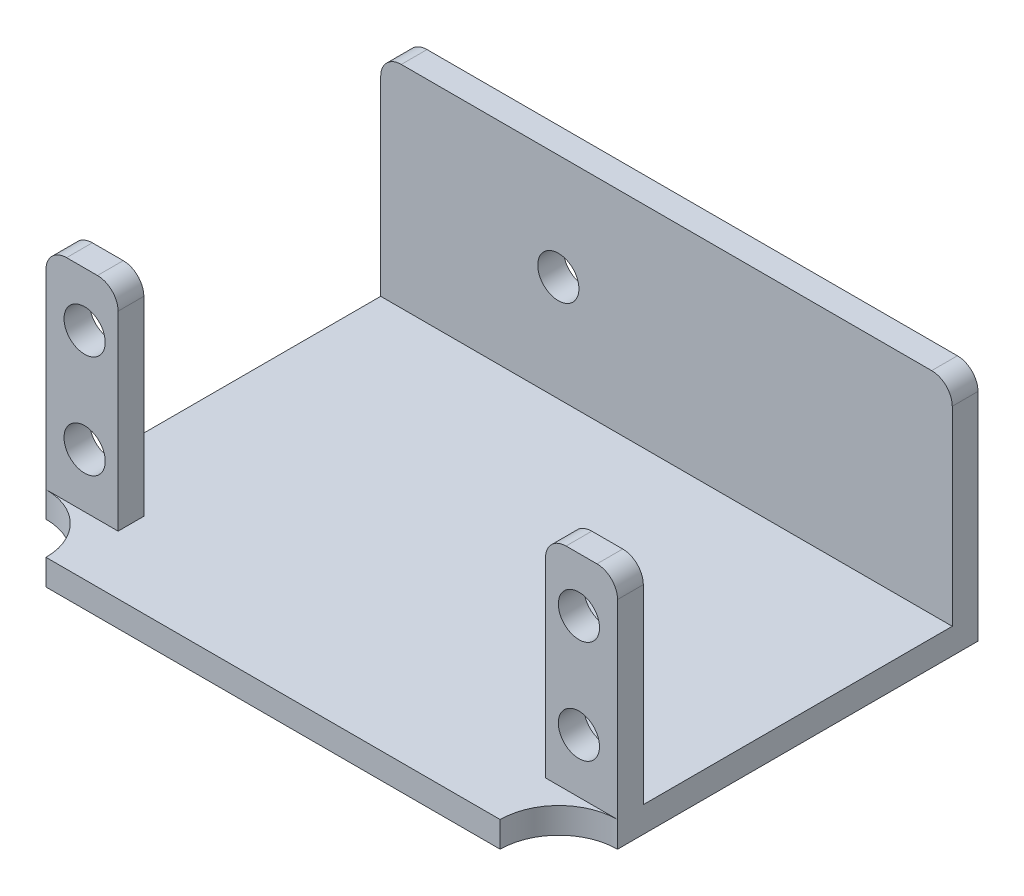
ISO-10303-21;
HEADER;
FILE_DESCRIPTION(('STEP AP214'),'2;1');
FILE_NAME('part.step','',(''),(''),'','','');
FILE_SCHEMA(('AUTOMOTIVE_DESIGN { 1 0 10303 214 1 1 1 1 }'));
ENDSEC;
DATA;
#1=APPLICATION_CONTEXT('core data for automotive mechanical design processes');
#2=APPLICATION_PROTOCOL_DEFINITION('international standard','automotive_design',2000,#1);
#3=PRODUCT_CONTEXT('',#1,'mechanical');
#4=PRODUCT('Part','Part','',(#3));
#5=PRODUCT_RELATED_PRODUCT_CATEGORY('part','',(#4));
#6=PRODUCT_DEFINITION_FORMATION('','',#4);
#7=PRODUCT_DEFINITION_CONTEXT('part definition',#1,'design');
#8=PRODUCT_DEFINITION('design','',#6,#7);
#9=PRODUCT_DEFINITION_SHAPE('','',#8);
#10=(LENGTH_UNIT() NAMED_UNIT(*) SI_UNIT(.MILLI.,.METRE.));
#11=(NAMED_UNIT(*) PLANE_ANGLE_UNIT() SI_UNIT($,.RADIAN.));
#12=(NAMED_UNIT(*) SI_UNIT($,.STERADIAN.) SOLID_ANGLE_UNIT());
#13=UNCERTAINTY_MEASURE_WITH_UNIT(LENGTH_MEASURE(1.E-05),#10,'distance_accuracy_value','');
#14=(GEOMETRIC_REPRESENTATION_CONTEXT(3) GLOBAL_UNCERTAINTY_ASSIGNED_CONTEXT((#13)) GLOBAL_UNIT_ASSIGNED_CONTEXT((#10,
#11,#12)) REPRESENTATION_CONTEXT('',''));
#15=CARTESIAN_POINT('',(0.,0.,0.));
#16=DIRECTION('',(0.,0.,1.));
#17=DIRECTION('',(1.,0.,0.));
#18=AXIS2_PLACEMENT_3D('',#15,#16,#17);
#19=CARTESIAN_POINT('',(0.,2.5,0.));
#20=DIRECTION('',(1.,0.,0.));
#21=DIRECTION('',(0.,0.,-1.));
#22=AXIS2_PLACEMENT_3D('',#19,#20,#21);
#23=PLANE('',#22);
#24=DIRECTION('',(0.,-1.,0.));
#25=VECTOR('',#24,1.);
#26=CARTESIAN_POINT('',(0.,2.5,-5.7));
#27=LINE('',#26,#25);
#28=CARTESIAN_POINT('',(0.,21.,-5.7));
#29=VERTEX_POINT('',#28);
#30=CARTESIAN_POINT('',(0.,2.5,-5.7));
#31=VERTEX_POINT('',#30);
#32=EDGE_CURVE('E256',#29,#31,#27,.T.);
#33=ORIENTED_EDGE('',*,*,#32,.F.);
#34=DIRECTION('',(0.,0.,-1.));
#35=VECTOR('',#34,1.);
#36=CARTESIAN_POINT('',(0.,21.,0.));
#37=LINE('',#36,#35);
#38=CARTESIAN_POINT('',(0.,21.,-8.2));
#39=VERTEX_POINT('',#38);
#40=EDGE_CURVE('E362',#29,#39,#37,.T.);
#41=ORIENTED_EDGE('',*,*,#40,.T.);
#42=DIRECTION('',(0.,-1.,0.));
#43=VECTOR('',#42,1.);
#44=CARTESIAN_POINT('',(0.,2.5,-8.2));
#45=LINE('',#44,#43);
#46=CARTESIAN_POINT('',(0.,2.5,-8.2));
#47=VERTEX_POINT('',#46);
#48=EDGE_CURVE('E255',#39,#47,#45,.T.);
#49=ORIENTED_EDGE('',*,*,#48,.T.);
#50=DIRECTION('',(0.,0.,1.));
#51=VECTOR('',#50,1.);
#52=CARTESIAN_POINT('',(0.,2.5,0.));
#53=LINE('',#52,#51);
#54=CARTESIAN_POINT('',(0.,2.5,-38.2));
#55=VERTEX_POINT('',#54);
#56=EDGE_CURVE('E289',#55,#47,#53,.T.);
#57=ORIENTED_EDGE('',*,*,#56,.F.);
#58=DIRECTION('',(0.,-1.,0.));
#59=VECTOR('',#58,1.);
#60=CARTESIAN_POINT('',(0.,78.5562777730834,-38.2));
#61=LINE('',#60,#59);
#62=CARTESIAN_POINT('',(0.,21.,-38.2));
#63=VERTEX_POINT('',#62);
#64=EDGE_CURVE('E404',#63,#55,#61,.T.);
#65=ORIENTED_EDGE('',*,*,#64,.F.);
#66=DIRECTION('',(0.,0.,-1.));
#67=VECTOR('',#66,1.);
#68=CARTESIAN_POINT('',(0.,21.,0.));
#69=LINE('',#68,#67);
#70=CARTESIAN_POINT('',(0.,21.,-40.7));
#71=VERTEX_POINT('',#70);
#72=EDGE_CURVE('E358',#63,#71,#69,.T.);
#73=ORIENTED_EDGE('',*,*,#72,.T.);
#74=DIRECTION('',(0.,-1.,0.));
#75=VECTOR('',#74,1.);
#76=CARTESIAN_POINT('',(0.,78.5562777730834,-40.7));
#77=LINE('',#76,#75);
#78=CARTESIAN_POINT('',(0.,0.,-40.7));
#79=VERTEX_POINT('',#78);
#80=EDGE_CURVE('E401',#71,#79,#77,.T.);
#81=ORIENTED_EDGE('',*,*,#80,.T.);
#82=DIRECTION('',(0.,0.,1.));
#83=VECTOR('',#82,1.);
#84=CARTESIAN_POINT('',(0.,0.,0.));
#85=LINE('',#84,#83);
#86=CARTESIAN_POINT('',(0.,0.,-5.7));
#87=VERTEX_POINT('',#86);
#88=EDGE_CURVE('E288',#79,#87,#85,.T.);
#89=ORIENTED_EDGE('',*,*,#88,.T.);
#90=DIRECTION('',(0.,1.,0.));
#91=VECTOR('',#90,1.);
#92=CARTESIAN_POINT('',(0.,0.,-5.7));
#93=LINE('',#92,#91);
#94=EDGE_CURVE('E416',#87,#31,#93,.T.);
#95=ORIENTED_EDGE('',*,*,#94,.T.);
#96=EDGE_LOOP('',(#33,#41,#49,#57,#65,#73,#81,#89,#95));
#97=FACE_BOUND('',#96,.T.);
#98=ADVANCED_FACE('F41',(#97),#23,.F.);
#99=CARTESIAN_POINT('',(0.,2.5,0.));
#100=DIRECTION('',(0.,0.,-1.));
#101=DIRECTION('',(-1.,0.,0.));
#102=AXIS2_PLACEMENT_3D('',#99,#100,#101);
#103=PLANE('',#102);
#104=DIRECTION('',(1.,0.,0.));
#105=VECTOR('',#104,1.);
#106=CARTESIAN_POINT('',(0.,2.5,0.));
#107=LINE('',#106,#105);
#108=CARTESIAN_POINT('',(5.7,2.5,0.));
#109=VERTEX_POINT('',#108);
#110=CARTESIAN_POINT('',(49.8,2.5,0.));
#111=VERTEX_POINT('',#110);
#112=EDGE_CURVE('E210',#109,#111,#107,.T.);
#113=ORIENTED_EDGE('',*,*,#112,.F.);
#114=DIRECTION('',(0.,1.,0.));
#115=VECTOR('',#114,1.);
#116=CARTESIAN_POINT('',(5.7,0.,0.));
#117=LINE('',#116,#115);
#118=CARTESIAN_POINT('',(5.7,0.,0.));
#119=VERTEX_POINT('',#118);
#120=EDGE_CURVE('E490',#109,#119,#117,.F.);
#121=ORIENTED_EDGE('',*,*,#120,.T.);
#122=DIRECTION('',(1.,0.,0.));
#123=VECTOR('',#122,1.);
#124=CARTESIAN_POINT('',(0.,0.,0.));
#125=LINE('',#124,#123);
#126=CARTESIAN_POINT('',(49.8,0.,0.));
#127=VERTEX_POINT('',#126);
#128=EDGE_CURVE('E308',#119,#127,#125,.T.);
#129=ORIENTED_EDGE('',*,*,#128,.T.);
#130=DIRECTION('',(0.,1.,0.));
#131=VECTOR('',#130,1.);
#132=CARTESIAN_POINT('',(49.8,0.,0.));
#133=LINE('',#132,#131);
#134=EDGE_CURVE('E196',#127,#111,#133,.T.);
#135=ORIENTED_EDGE('',*,*,#134,.T.);
#136=EDGE_LOOP('',(#113,#121,#129,#135));
#137=FACE_BOUND('',#136,.T.);
#138=ADVANCED_FACE('F506',(#137),#103,.F.);
#139=CARTESIAN_POINT('',(55.5,2.5,0.));
#140=DIRECTION('',(-1.,0.,0.));
#141=DIRECTION('',(0.,0.,1.));
#142=AXIS2_PLACEMENT_3D('',#139,#140,#141);
#143=PLANE('',#142);
#144=DIRECTION('',(0.,1.,0.));
#145=VECTOR('',#144,1.);
#146=CARTESIAN_POINT('',(55.5,2.5,-8.2));
#147=LINE('',#146,#145);
#148=CARTESIAN_POINT('',(55.5,2.5,-8.2));
#149=VERTEX_POINT('',#148);
#150=CARTESIAN_POINT('',(55.5,21.,-8.2));
#151=VERTEX_POINT('',#150);
#152=EDGE_CURVE('E243',#149,#151,#147,.T.);
#153=ORIENTED_EDGE('',*,*,#152,.T.);
#154=DIRECTION('',(0.,0.,-1.));
#155=VECTOR('',#154,1.);
#156=CARTESIAN_POINT('',(55.5,21.,0.));
#157=LINE('',#156,#155);
#158=CARTESIAN_POINT('',(55.5,21.,-5.7));
#159=VERTEX_POINT('',#158);
#160=EDGE_CURVE('E227',#151,#159,#157,.F.);
#161=ORIENTED_EDGE('',*,*,#160,.T.);
#162=DIRECTION('',(0.,1.,0.));
#163=VECTOR('',#162,1.);
#164=CARTESIAN_POINT('',(55.5,2.5,-5.7));
#165=LINE('',#164,#163);
#166=CARTESIAN_POINT('',(55.5,2.5,-5.7));
#167=VERTEX_POINT('',#166);
#168=EDGE_CURVE('E217',#167,#159,#165,.T.);
#169=ORIENTED_EDGE('',*,*,#168,.F.);
#170=DIRECTION('',(0.,1.,0.));
#171=VECTOR('',#170,1.);
#172=CARTESIAN_POINT('',(55.5,0.,-5.7));
#173=LINE('',#172,#171);
#174=CARTESIAN_POINT('',(55.5,0.,-5.7));
#175=VERTEX_POINT('',#174);
#176=EDGE_CURVE('E184',#167,#175,#173,.F.);
#177=ORIENTED_EDGE('',*,*,#176,.T.);
#178=DIRECTION('',(0.,0.,-1.));
#179=VECTOR('',#178,1.);
#180=CARTESIAN_POINT('',(55.5,0.,0.));
#181=LINE('',#180,#179);
#182=CARTESIAN_POINT('',(55.5,0.,-40.7));
#183=VERTEX_POINT('',#182);
#184=EDGE_CURVE('E293',#175,#183,#181,.T.);
#185=ORIENTED_EDGE('',*,*,#184,.T.);
#186=DIRECTION('',(0.,-1.,0.));
#187=VECTOR('',#186,1.);
#188=CARTESIAN_POINT('',(55.5,78.5562777730834,-40.7));
#189=LINE('',#188,#187);
#190=CARTESIAN_POINT('',(55.5,21.,-40.7));
#191=VERTEX_POINT('',#190);
#192=EDGE_CURVE('E410',#191,#183,#189,.T.);
#193=ORIENTED_EDGE('',*,*,#192,.F.);
#194=DIRECTION('',(0.,0.,1.));
#195=VECTOR('',#194,1.);
#196=CARTESIAN_POINT('',(55.5,21.,0.));
#197=LINE('',#196,#195);
#198=CARTESIAN_POINT('',(55.5,21.,-38.2));
#199=VERTEX_POINT('',#198);
#200=EDGE_CURVE('E366',#191,#199,#197,.T.);
#201=ORIENTED_EDGE('',*,*,#200,.T.);
#202=DIRECTION('',(0.,-1.,0.));
#203=VECTOR('',#202,1.);
#204=CARTESIAN_POINT('',(55.5,78.5562777730834,-38.2));
#205=LINE('',#204,#203);
#206=CARTESIAN_POINT('',(55.5,2.5,-38.2));
#207=VERTEX_POINT('',#206);
#208=EDGE_CURVE('E414',#199,#207,#205,.T.);
#209=ORIENTED_EDGE('',*,*,#208,.T.);
#210=DIRECTION('',(0.,0.,-1.));
#211=VECTOR('',#210,1.);
#212=CARTESIAN_POINT('',(55.5,2.5,0.));
#213=LINE('',#212,#211);
#214=EDGE_CURVE('E296',#149,#207,#213,.T.);
#215=ORIENTED_EDGE('',*,*,#214,.F.);
#216=EDGE_LOOP('',(#153,#161,#169,#177,#185,#193,#201,#209,#215));
#217=FACE_BOUND('',#216,.T.);
#218=ADVANCED_FACE('F225',(#217),#143,.F.);
#219=CARTESIAN_POINT('',(0.,2.5,0.));
#220=DIRECTION('',(0.,-1.,0.));
#221=DIRECTION('',(0.,0.,-1.));
#222=AXIS2_PLACEMENT_3D('',#219,#220,#221);
#223=PLANE('',#222);
#224=DIRECTION('',(1.,0.,0.));
#225=VECTOR('',#224,1.);
#226=CARTESIAN_POINT('',(0.,2.5,-5.7));
#227=LINE('',#226,#225);
#228=CARTESIAN_POINT('',(7.,2.5,-5.7));
#229=VERTEX_POINT('',#228);
#230=EDGE_CURVE('E259',#31,#229,#227,.T.);
#231=ORIENTED_EDGE('',*,*,#230,.F.);
#232=CARTESIAN_POINT('',(0.,2.5,0.));
#233=DIRECTION('',(0.,1.,0.));
#234=DIRECTION('',(0.,0.,1.));
#235=AXIS2_PLACEMENT_3D('',#232,#233,#234);
#236=CIRCLE('',#235,5.7);
#237=EDGE_CURVE('E486',#109,#31,#236,.T.);
#238=ORIENTED_EDGE('',*,*,#237,.F.);
#239=ORIENTED_EDGE('',*,*,#112,.T.);
#240=CARTESIAN_POINT('',(55.5,2.5,0.));
#241=DIRECTION('',(0.,1.,0.));
#242=DIRECTION('',(0.,0.,1.));
#243=AXIS2_PLACEMENT_3D('',#240,#241,#242);
#244=CIRCLE('',#243,5.7);
#245=EDGE_CURVE('E187',#167,#111,#244,.T.);
#246=ORIENTED_EDGE('',*,*,#245,.F.);
#247=DIRECTION('',(1.,0.,0.));
#248=VECTOR('',#247,1.);
#249=CARTESIAN_POINT('',(55.5,2.5,-5.7));
#250=LINE('',#249,#248);
#251=CARTESIAN_POINT('',(48.5,2.5,-5.7));
#252=VERTEX_POINT('',#251);
#253=EDGE_CURVE('E206',#252,#167,#250,.T.);
#254=ORIENTED_EDGE('',*,*,#253,.F.);
#255=DIRECTION('',(0.,0.,-1.));
#256=VECTOR('',#255,1.);
#257=CARTESIAN_POINT('',(48.5,2.5,-5.7));
#258=LINE('',#257,#256);
#259=CARTESIAN_POINT('',(48.5,2.5,-8.2));
#260=VERTEX_POINT('',#259);
#261=EDGE_CURVE('E222',#252,#260,#258,.T.);
#262=ORIENTED_EDGE('',*,*,#261,.T.);
#263=DIRECTION('',(1.,0.,0.));
#264=VECTOR('',#263,1.);
#265=CARTESIAN_POINT('',(55.5,2.5,-8.2));
#266=LINE('',#265,#264);
#267=EDGE_CURVE('E230',#260,#149,#266,.T.);
#268=ORIENTED_EDGE('',*,*,#267,.T.);
#269=ORIENTED_EDGE('',*,*,#214,.T.);
#270=DIRECTION('',(-1.,0.,0.));
#271=VECTOR('',#270,1.);
#272=CARTESIAN_POINT('',(0.,2.5,-38.2));
#273=LINE('',#272,#271);
#274=EDGE_CURVE('E300',#207,#55,#273,.T.);
#275=ORIENTED_EDGE('',*,*,#274,.T.);
#276=ORIENTED_EDGE('',*,*,#56,.T.);
#277=DIRECTION('',(1.,0.,0.));
#278=VECTOR('',#277,1.);
#279=CARTESIAN_POINT('',(0.,2.5,-8.2));
#280=LINE('',#279,#278);
#281=CARTESIAN_POINT('',(7.,2.5,-8.2));
#282=VERTEX_POINT('',#281);
#283=EDGE_CURVE('E275',#47,#282,#280,.T.);
#284=ORIENTED_EDGE('',*,*,#283,.T.);
#285=DIRECTION('',(0.,0.,-1.));
#286=VECTOR('',#285,1.);
#287=CARTESIAN_POINT('',(7.,2.5,-5.7));
#288=LINE('',#287,#286);
#289=EDGE_CURVE('E272',#229,#282,#288,.T.);
#290=ORIENTED_EDGE('',*,*,#289,.F.);
#291=EDGE_LOOP('',(#231,#238,#239,#246,#254,#262,#268,#269,#275,#276,#284,#290));
#292=FACE_BOUND('',#291,.T.);
#293=ADVANCED_FACE('F204',(#292),#223,.F.);
#294=CARTESIAN_POINT('',(0.,0.,0.));
#295=DIRECTION('',(0.,-1.,0.));
#296=DIRECTION('',(0.,0.,-1.));
#297=AXIS2_PLACEMENT_3D('',#294,#295,#296);
#298=PLANE('',#297);
#299=CARTESIAN_POINT('',(0.,0.,0.));
#300=DIRECTION('',(0.,1.,0.));
#301=DIRECTION('',(0.,0.,1.));
#302=AXIS2_PLACEMENT_3D('',#299,#300,#301);
#303=CIRCLE('',#302,5.7);
#304=EDGE_CURVE('E197',#119,#87,#303,.T.);
#305=ORIENTED_EDGE('',*,*,#304,.T.);
#306=ORIENTED_EDGE('',*,*,#88,.F.);
#307=DIRECTION('',(-1.,0.,0.));
#308=VECTOR('',#307,1.);
#309=CARTESIAN_POINT('',(0.,0.,-40.7));
#310=LINE('',#309,#308);
#311=EDGE_CURVE('E408',#183,#79,#310,.T.);
#312=ORIENTED_EDGE('',*,*,#311,.F.);
#313=ORIENTED_EDGE('',*,*,#184,.F.);
#314=CARTESIAN_POINT('',(55.5,0.,0.));
#315=DIRECTION('',(0.,1.,0.));
#316=DIRECTION('',(0.,0.,1.));
#317=AXIS2_PLACEMENT_3D('',#314,#315,#316);
#318=CIRCLE('',#317,5.7);
#319=EDGE_CURVE('E190',#175,#127,#318,.T.);
#320=ORIENTED_EDGE('',*,*,#319,.T.);
#321=ORIENTED_EDGE('',*,*,#128,.F.);
#322=EDGE_LOOP('',(#305,#306,#312,#313,#320,#321));
#323=FACE_BOUND('',#322,.T.);
#324=ADVANCED_FACE('F508',(#323),#298,.T.);
#325=CARTESIAN_POINT('',(7.,2.5,-5.7));
#326=DIRECTION('',(-1.,0.,0.));
#327=DIRECTION('',(0.,0.,1.));
#328=AXIS2_PLACEMENT_3D('',#325,#326,#327);
#329=PLANE('',#328);
#330=DIRECTION('',(0.,1.,0.));
#331=VECTOR('',#330,1.);
#332=CARTESIAN_POINT('',(7.,2.5,-8.2));
#333=LINE('',#332,#331);
#334=CARTESIAN_POINT('',(7.,21.,-8.2));
#335=VERTEX_POINT('',#334);
#336=EDGE_CURVE('E278',#282,#335,#333,.T.);
#337=ORIENTED_EDGE('',*,*,#336,.T.);
#338=DIRECTION('',(0.,0.,-1.));
#339=VECTOR('',#338,1.);
#340=CARTESIAN_POINT('',(7.,21.,-5.7));
#341=LINE('',#340,#339);
#342=CARTESIAN_POINT('',(7.,21.,-5.7));
#343=VERTEX_POINT('',#342);
#344=EDGE_CURVE('E326',#335,#343,#341,.F.);
#345=ORIENTED_EDGE('',*,*,#344,.T.);
#346=DIRECTION('',(0.,1.,0.));
#347=VECTOR('',#346,1.);
#348=CARTESIAN_POINT('',(7.,2.5,-5.7));
#349=LINE('',#348,#347);
#350=EDGE_CURVE('E264',#229,#343,#349,.T.);
#351=ORIENTED_EDGE('',*,*,#350,.F.);
#352=ORIENTED_EDGE('',*,*,#289,.T.);
#353=EDGE_LOOP('',(#337,#345,#351,#352));
#354=FACE_BOUND('',#353,.T.);
#355=ADVANCED_FACE('F633',(#354),#329,.F.);
#356=CARTESIAN_POINT('',(0.,23.,-5.7));
#357=DIRECTION('',(0.,-1.,0.));
#358=DIRECTION('',(0.,0.,-1.));
#359=AXIS2_PLACEMENT_3D('',#356,#357,#358);
#360=PLANE('',#359);
#361=DIRECTION('',(-1.,0.,0.));
#362=VECTOR('',#361,1.);
#363=CARTESIAN_POINT('',(0.,23.,-5.7));
#364=LINE('',#363,#362);
#365=CARTESIAN_POINT('',(5.,23.,-5.7));
#366=VERTEX_POINT('',#365);
#367=CARTESIAN_POINT('',(2.,23.,-5.7));
#368=VERTEX_POINT('',#367);
#369=EDGE_CURVE('E268',#366,#368,#364,.T.);
#370=ORIENTED_EDGE('',*,*,#369,.F.);
#371=DIRECTION('',(0.,0.,-1.));
#372=VECTOR('',#371,1.);
#373=CARTESIAN_POINT('',(5.,23.,-5.7));
#374=LINE('',#373,#372);
#375=CARTESIAN_POINT('',(5.,23.,-8.2));
#376=VERTEX_POINT('',#375);
#377=EDGE_CURVE('E316',#366,#376,#374,.T.);
#378=ORIENTED_EDGE('',*,*,#377,.T.);
#379=DIRECTION('',(-1.,0.,0.));
#380=VECTOR('',#379,1.);
#381=CARTESIAN_POINT('',(0.,23.,-8.2));
#382=LINE('',#381,#380);
#383=CARTESIAN_POINT('',(2.,23.,-8.2));
#384=VERTEX_POINT('',#383);
#385=EDGE_CURVE('E260',#376,#384,#382,.T.);
#386=ORIENTED_EDGE('',*,*,#385,.T.);
#387=DIRECTION('',(0.,0.,-1.));
#388=VECTOR('',#387,1.);
#389=CARTESIAN_POINT('',(2.,23.,-5.7));
#390=LINE('',#389,#388);
#391=EDGE_CURVE('E304',#384,#368,#390,.F.);
#392=ORIENTED_EDGE('',*,*,#391,.T.);
#393=EDGE_LOOP('',(#370,#378,#386,#392));
#394=FACE_BOUND('',#393,.T.);
#395=ADVANCED_FACE('F461',(#394),#360,.F.);
#396=CARTESIAN_POINT('',(0.,0.,-5.7));
#397=DIRECTION('',(0.,0.,-1.));
#398=DIRECTION('',(-1.,0.,0.));
#399=AXIS2_PLACEMENT_3D('',#396,#397,#398);
#400=PLANE('',#399);
#401=CARTESIAN_POINT('',(3.75,7.75,-5.7));
#402=DIRECTION('',(0.,0.,1.));
#403=DIRECTION('',(-1.,0.,0.));
#404=AXIS2_PLACEMENT_3D('',#401,#402,#403);
#405=CIRCLE('',#404,2.);
#406=CARTESIAN_POINT('',(1.75,7.75,-5.7));
#407=VERTEX_POINT('',#406);
#408=EDGE_CURVE('E429',#407,#407,#405,.T.);
#409=ORIENTED_EDGE('',*,*,#408,.F.);
#410=EDGE_LOOP('',(#409));
#411=FACE_BOUND('',#410,.T.);
#412=CARTESIAN_POINT('',(3.75,17.75,-5.7));
#413=DIRECTION('',(0.,0.,1.));
#414=DIRECTION('',(1.,0.,0.));
#415=AXIS2_PLACEMENT_3D('',#412,#413,#414);
#416=CIRCLE('',#415,2.);
#417=CARTESIAN_POINT('',(5.75,17.75,-5.7));
#418=VERTEX_POINT('',#417);
#419=EDGE_CURVE('E238',#418,#418,#416,.T.);
#420=ORIENTED_EDGE('',*,*,#419,.F.);
#421=EDGE_LOOP('',(#420));
#422=FACE_BOUND('',#421,.T.);
#423=ORIENTED_EDGE('',*,*,#350,.T.);
#424=CARTESIAN_POINT('',(5.,21.,-5.7));
#425=DIRECTION('',(0.,0.,-1.));
#426=DIRECTION('',(-1.,0.,0.));
#427=AXIS2_PLACEMENT_3D('',#424,#425,#426);
#428=CIRCLE('',#427,2.);
#429=EDGE_CURVE('E332',#343,#366,#428,.F.);
#430=ORIENTED_EDGE('',*,*,#429,.T.);
#431=ORIENTED_EDGE('',*,*,#369,.T.);
#432=CARTESIAN_POINT('',(2.,21.,-5.7));
#433=DIRECTION('',(0.,0.,-1.));
#434=DIRECTION('',(-1.,0.,0.));
#435=AXIS2_PLACEMENT_3D('',#432,#433,#434);
#436=CIRCLE('',#435,2.);
#437=EDGE_CURVE('E329',#368,#29,#436,.F.);
#438=ORIENTED_EDGE('',*,*,#437,.T.);
#439=ORIENTED_EDGE('',*,*,#32,.T.);
#440=ORIENTED_EDGE('',*,*,#230,.T.);
#441=EDGE_LOOP('',(#423,#430,#431,#438,#439,#440));
#442=FACE_BOUND('',#441,.T.);
#443=ADVANCED_FACE('F457',(#411,#422,#442),#400,.F.);
#444=CARTESIAN_POINT('',(0.,0.,-8.2));
#445=DIRECTION('',(0.,0.,-1.));
#446=DIRECTION('',(-1.,0.,0.));
#447=AXIS2_PLACEMENT_3D('',#444,#445,#446);
#448=PLANE('',#447);
#449=CARTESIAN_POINT('',(3.75,7.75,-8.2));
#450=DIRECTION('',(0.,0.,1.));
#451=DIRECTION('',(-1.,0.,0.));
#452=AXIS2_PLACEMENT_3D('',#449,#450,#451);
#453=CIRCLE('',#452,2.);
#454=CARTESIAN_POINT('',(1.75,7.75,-8.2));
#455=VERTEX_POINT('',#454);
#456=EDGE_CURVE('E425',#455,#455,#453,.T.);
#457=ORIENTED_EDGE('',*,*,#456,.T.);
#458=EDGE_LOOP('',(#457));
#459=FACE_BOUND('',#458,.T.);
#460=CARTESIAN_POINT('',(3.75,17.75,-8.2));
#461=DIRECTION('',(0.,0.,1.));
#462=DIRECTION('',(1.,0.,0.));
#463=AXIS2_PLACEMENT_3D('',#460,#461,#462);
#464=CIRCLE('',#463,2.);
#465=CARTESIAN_POINT('',(5.75,17.75,-8.2));
#466=VERTEX_POINT('',#465);
#467=EDGE_CURVE('E247',#466,#466,#464,.T.);
#468=ORIENTED_EDGE('',*,*,#467,.T.);
#469=EDGE_LOOP('',(#468));
#470=FACE_BOUND('',#469,.T.);
#471=ORIENTED_EDGE('',*,*,#385,.F.);
#472=CARTESIAN_POINT('',(5.,21.,-8.2));
#473=DIRECTION('',(0.,0.,-1.));
#474=DIRECTION('',(-1.,0.,0.));
#475=AXIS2_PLACEMENT_3D('',#472,#473,#474);
#476=CIRCLE('',#475,2.);
#477=EDGE_CURVE('E323',#376,#335,#476,.T.);
#478=ORIENTED_EDGE('',*,*,#477,.T.);
#479=ORIENTED_EDGE('',*,*,#336,.F.);
#480=ORIENTED_EDGE('',*,*,#283,.F.);
#481=ORIENTED_EDGE('',*,*,#48,.F.);
#482=CARTESIAN_POINT('',(2.,21.,-8.2));
#483=DIRECTION('',(0.,0.,-1.));
#484=DIRECTION('',(-1.,0.,0.));
#485=AXIS2_PLACEMENT_3D('',#482,#483,#484);
#486=CIRCLE('',#485,2.);
#487=EDGE_CURVE('E320',#39,#384,#486,.T.);
#488=ORIENTED_EDGE('',*,*,#487,.T.);
#489=EDGE_LOOP('',(#471,#478,#479,#480,#481,#488));
#490=FACE_BOUND('',#489,.T.);
#491=ADVANCED_FACE('F460',(#459,#470,#490),#448,.T.);
#492=CARTESIAN_POINT('',(55.5,23.,-5.7));
#493=DIRECTION('',(0.,-1.,0.));
#494=DIRECTION('',(0.,0.,-1.));
#495=AXIS2_PLACEMENT_3D('',#492,#493,#494);
#496=PLANE('',#495);
#497=DIRECTION('',(-1.,0.,0.));
#498=VECTOR('',#497,1.);
#499=CARTESIAN_POINT('',(55.5,23.,-8.2));
#500=LINE('',#499,#498);
#501=CARTESIAN_POINT('',(53.5,23.,-8.2));
#502=VERTEX_POINT('',#501);
#503=CARTESIAN_POINT('',(50.5,23.,-8.2));
#504=VERTEX_POINT('',#503);
#505=EDGE_CURVE('E246',#502,#504,#500,.T.);
#506=ORIENTED_EDGE('',*,*,#505,.T.);
#507=DIRECTION('',(0.,0.,-1.));
#508=VECTOR('',#507,1.);
#509=CARTESIAN_POINT('',(50.5,23.,-5.7));
#510=LINE('',#509,#508);
#511=CARTESIAN_POINT('',(50.5,23.,-5.7));
#512=VERTEX_POINT('',#511);
#513=EDGE_CURVE('E349',#504,#512,#510,.F.);
#514=ORIENTED_EDGE('',*,*,#513,.T.);
#515=DIRECTION('',(-1.,0.,0.));
#516=VECTOR('',#515,1.);
#517=CARTESIAN_POINT('',(55.5,23.,-5.7));
#518=LINE('',#517,#516);
#519=CARTESIAN_POINT('',(53.5,23.,-5.7));
#520=VERTEX_POINT('',#519);
#521=EDGE_CURVE('E229',#520,#512,#518,.T.);
#522=ORIENTED_EDGE('',*,*,#521,.F.);
#523=DIRECTION('',(0.,0.,-1.));
#524=VECTOR('',#523,1.);
#525=CARTESIAN_POINT('',(53.5,23.,-5.7));
#526=LINE('',#525,#524);
#527=EDGE_CURVE('E345',#520,#502,#526,.T.);
#528=ORIENTED_EDGE('',*,*,#527,.T.);
#529=EDGE_LOOP('',(#506,#514,#522,#528));
#530=FACE_BOUND('',#529,.T.);
#531=ADVANCED_FACE('F623',(#530),#496,.F.);
#532=CARTESIAN_POINT('',(48.5,2.5,-5.7));
#533=DIRECTION('',(1.,0.,0.));
#534=DIRECTION('',(0.,0.,-1.));
#535=AXIS2_PLACEMENT_3D('',#532,#533,#534);
#536=PLANE('',#535);
#537=DIRECTION('',(0.,-1.,0.));
#538=VECTOR('',#537,1.);
#539=CARTESIAN_POINT('',(48.5,2.5,-5.7));
#540=LINE('',#539,#538);
#541=CARTESIAN_POINT('',(48.5,21.,-5.7));
#542=VERTEX_POINT('',#541);
#543=EDGE_CURVE('E220',#542,#252,#540,.T.);
#544=ORIENTED_EDGE('',*,*,#543,.F.);
#545=DIRECTION('',(0.,0.,-1.));
#546=VECTOR('',#545,1.);
#547=CARTESIAN_POINT('',(48.5,21.,-5.7));
#548=LINE('',#547,#546);
#549=CARTESIAN_POINT('',(48.5,21.,-8.2));
#550=VERTEX_POINT('',#549);
#551=EDGE_CURVE('E335',#542,#550,#548,.T.);
#552=ORIENTED_EDGE('',*,*,#551,.T.);
#553=DIRECTION('',(0.,-1.,0.));
#554=VECTOR('',#553,1.);
#555=CARTESIAN_POINT('',(48.5,2.5,-8.2));
#556=LINE('',#555,#554);
#557=EDGE_CURVE('E235',#550,#260,#556,.T.);
#558=ORIENTED_EDGE('',*,*,#557,.T.);
#559=ORIENTED_EDGE('',*,*,#261,.F.);
#560=EDGE_LOOP('',(#544,#552,#558,#559));
#561=FACE_BOUND('',#560,.T.);
#562=ADVANCED_FACE('F616',(#561),#536,.F.);
#563=CARTESIAN_POINT('',(0.,0.,-5.7));
#564=DIRECTION('',(0.,0.,1.));
#565=DIRECTION('',(1.,0.,0.));
#566=AXIS2_PLACEMENT_3D('',#563,#564,#565);
#567=PLANE('',#566);
#568=CARTESIAN_POINT('',(51.75,17.75,-5.7));
#569=DIRECTION('',(0.,0.,1.));
#570=DIRECTION('',(-1.,0.,0.));
#571=AXIS2_PLACEMENT_3D('',#568,#569,#570);
#572=CIRCLE('',#571,2.);
#573=CARTESIAN_POINT('',(49.75,17.75,-5.7));
#574=VERTEX_POINT('',#573);
#575=EDGE_CURVE('E396',#574,#574,#572,.T.);
#576=ORIENTED_EDGE('',*,*,#575,.F.);
#577=EDGE_LOOP('',(#576));
#578=FACE_BOUND('',#577,.T.);
#579=CARTESIAN_POINT('',(51.75,7.75,-5.7));
#580=DIRECTION('',(0.,0.,1.));
#581=DIRECTION('',(1.,0.,0.));
#582=AXIS2_PLACEMENT_3D('',#579,#580,#581);
#583=CIRCLE('',#582,2.);
#584=CARTESIAN_POINT('',(53.75,7.75,-5.7));
#585=VERTEX_POINT('',#584);
#586=EDGE_CURVE('E437',#585,#585,#583,.T.);
#587=ORIENTED_EDGE('',*,*,#586,.F.);
#588=EDGE_LOOP('',(#587));
#589=FACE_BOUND('',#588,.T.);
#590=ORIENTED_EDGE('',*,*,#521,.T.);
#591=CARTESIAN_POINT('',(50.5,21.,-5.7));
#592=DIRECTION('',(0.,0.,1.));
#593=DIRECTION('',(1.,0.,0.));
#594=AXIS2_PLACEMENT_3D('',#591,#592,#593);
#595=CIRCLE('',#594,2.);
#596=EDGE_CURVE('E355',#512,#542,#595,.T.);
#597=ORIENTED_EDGE('',*,*,#596,.T.);
#598=ORIENTED_EDGE('',*,*,#543,.T.);
#599=ORIENTED_EDGE('',*,*,#253,.T.);
#600=ORIENTED_EDGE('',*,*,#168,.T.);
#601=CARTESIAN_POINT('',(53.5,21.,-5.7));
#602=DIRECTION('',(0.,0.,1.));
#603=DIRECTION('',(1.,0.,0.));
#604=AXIS2_PLACEMENT_3D('',#601,#602,#603);
#605=CIRCLE('',#604,2.);
#606=EDGE_CURVE('E352',#159,#520,#605,.T.);
#607=ORIENTED_EDGE('',*,*,#606,.T.);
#608=EDGE_LOOP('',(#590,#597,#598,#599,#600,#607));
#609=FACE_BOUND('',#608,.T.);
#610=ADVANCED_FACE('F216',(#578,#589,#609),#567,.T.);
#611=CARTESIAN_POINT('',(0.,0.,-8.2));
#612=DIRECTION('',(0.,0.,1.));
#613=DIRECTION('',(1.,0.,0.));
#614=AXIS2_PLACEMENT_3D('',#611,#612,#613);
#615=PLANE('',#614);
#616=CARTESIAN_POINT('',(51.75,17.75,-8.2));
#617=DIRECTION('',(0.,0.,1.));
#618=DIRECTION('',(-1.,0.,0.));
#619=AXIS2_PLACEMENT_3D('',#616,#617,#618);
#620=CIRCLE('',#619,2.);
#621=CARTESIAN_POINT('',(49.75,17.75,-8.2));
#622=VERTEX_POINT('',#621);
#623=EDGE_CURVE('E441',#622,#622,#620,.T.);
#624=ORIENTED_EDGE('',*,*,#623,.T.);
#625=EDGE_LOOP('',(#624));
#626=FACE_BOUND('',#625,.T.);
#627=CARTESIAN_POINT('',(51.75,7.75,-8.2));
#628=DIRECTION('',(0.,0.,1.));
#629=DIRECTION('',(1.,0.,0.));
#630=AXIS2_PLACEMENT_3D('',#627,#628,#629);
#631=CIRCLE('',#630,2.);
#632=CARTESIAN_POINT('',(53.75,7.75,-8.2));
#633=VERTEX_POINT('',#632);
#634=EDGE_CURVE('E433',#633,#633,#631,.T.);
#635=ORIENTED_EDGE('',*,*,#634,.T.);
#636=EDGE_LOOP('',(#635));
#637=FACE_BOUND('',#636,.T.);
#638=ORIENTED_EDGE('',*,*,#557,.F.);
#639=CARTESIAN_POINT('',(50.5,21.,-8.2));
#640=DIRECTION('',(0.,0.,1.));
#641=DIRECTION('',(1.,0.,0.));
#642=AXIS2_PLACEMENT_3D('',#639,#640,#641);
#643=CIRCLE('',#642,2.);
#644=EDGE_CURVE('E342',#550,#504,#643,.F.);
#645=ORIENTED_EDGE('',*,*,#644,.T.);
#646=ORIENTED_EDGE('',*,*,#505,.F.);
#647=CARTESIAN_POINT('',(53.5,21.,-8.2));
#648=DIRECTION('',(0.,0.,1.));
#649=DIRECTION('',(1.,0.,0.));
#650=AXIS2_PLACEMENT_3D('',#647,#648,#649);
#651=CIRCLE('',#650,2.);
#652=EDGE_CURVE('E339',#502,#151,#651,.F.);
#653=ORIENTED_EDGE('',*,*,#652,.T.);
#654=ORIENTED_EDGE('',*,*,#152,.F.);
#655=ORIENTED_EDGE('',*,*,#267,.F.);
#656=EDGE_LOOP('',(#638,#645,#646,#653,#654,#655));
#657=FACE_BOUND('',#656,.T.);
#658=ADVANCED_FACE('F606',(#626,#637,#657),#615,.F.);
#659=CARTESIAN_POINT('',(51.75,7.75,-8.2));
#660=DIRECTION('',(0.,0.,1.));
#661=DIRECTION('',(1.,0.,0.));
#662=AXIS2_PLACEMENT_3D('',#659,#660,#661);
#663=CYLINDRICAL_SURFACE('',#662,2.);
#664=ORIENTED_EDGE('',*,*,#634,.F.);
#665=EDGE_LOOP('',(#664));
#666=FACE_BOUND('',#665,.T.);
#667=ORIENTED_EDGE('',*,*,#586,.T.);
#668=EDGE_LOOP('',(#667));
#669=FACE_BOUND('',#668,.T.);
#670=ADVANCED_FACE('F602',(#666,#669),#663,.F.);
#671=CARTESIAN_POINT('',(51.75,17.75,-8.2));
#672=DIRECTION('',(0.,0.,1.));
#673=DIRECTION('',(1.,0.,0.));
#674=AXIS2_PLACEMENT_3D('',#671,#672,#673);
#675=CYLINDRICAL_SURFACE('',#674,2.);
#676=ORIENTED_EDGE('',*,*,#623,.F.);
#677=EDGE_LOOP('',(#676));
#678=FACE_BOUND('',#677,.T.);
#679=ORIENTED_EDGE('',*,*,#575,.T.);
#680=EDGE_LOOP('',(#679));
#681=FACE_BOUND('',#680,.T.);
#682=ADVANCED_FACE('F605',(#678,#681),#675,.F.);
#683=CARTESIAN_POINT('',(3.75,17.75,-8.2));
#684=DIRECTION('',(0.,0.,1.));
#685=DIRECTION('',(1.,0.,0.));
#686=AXIS2_PLACEMENT_3D('',#683,#684,#685);
#687=CYLINDRICAL_SURFACE('',#686,2.);
#688=ORIENTED_EDGE('',*,*,#467,.F.);
#689=EDGE_LOOP('',(#688));
#690=FACE_BOUND('',#689,.T.);
#691=ORIENTED_EDGE('',*,*,#419,.T.);
#692=EDGE_LOOP('',(#691));
#693=FACE_BOUND('',#692,.T.);
#694=ADVANCED_FACE('F455',(#690,#693),#687,.F.);
#695=CARTESIAN_POINT('',(3.75,7.75,-8.2));
#696=DIRECTION('',(0.,0.,1.));
#697=DIRECTION('',(1.,0.,0.));
#698=AXIS2_PLACEMENT_3D('',#695,#696,#697);
#699=CYLINDRICAL_SURFACE('',#698,2.);
#700=ORIENTED_EDGE('',*,*,#456,.F.);
#701=EDGE_LOOP('',(#700));
#702=FACE_BOUND('',#701,.T.);
#703=ORIENTED_EDGE('',*,*,#408,.T.);
#704=EDGE_LOOP('',(#703));
#705=FACE_BOUND('',#704,.T.);
#706=ADVANCED_FACE('F567',(#702,#705),#699,.F.);
#707=CARTESIAN_POINT('',(0.,78.5562777730834,-40.7));
#708=DIRECTION('',(0.,0.,1.));
#709=DIRECTION('',(1.,0.,0.));
#710=AXIS2_PLACEMENT_3D('',#707,#708,#709);
#711=PLANE('',#710);
#712=CARTESIAN_POINT('',(17.25,12.75,-40.7));
#713=DIRECTION('',(0.,0.,-1.));
#714=DIRECTION('',(-1.,0.,0.));
#715=AXIS2_PLACEMENT_3D('',#712,#713,#714);
#716=CIRCLE('',#715,2.);
#717=CARTESIAN_POINT('',(15.25,12.75,-40.7));
#718=VERTEX_POINT('',#717);
#719=EDGE_CURVE('E807',#718,#718,#716,.T.);
#720=ORIENTED_EDGE('',*,*,#719,.F.);
#721=EDGE_LOOP('',(#720));
#722=FACE_BOUND('',#721,.T.);
#723=DIRECTION('',(1.,0.,0.));
#724=VECTOR('',#723,1.);
#725=CARTESIAN_POINT('',(0.,23.,-40.7));
#726=LINE('',#725,#724);
#727=CARTESIAN_POINT('',(2.,23.,-40.7));
#728=VERTEX_POINT('',#727);
#729=CARTESIAN_POINT('',(53.5,23.,-40.7));
#730=VERTEX_POINT('',#729);
#731=EDGE_CURVE('E388',#728,#730,#726,.T.);
#732=ORIENTED_EDGE('',*,*,#731,.T.);
#733=CARTESIAN_POINT('',(53.5,21.,-40.7));
#734=DIRECTION('',(0.,0.,1.));
#735=DIRECTION('',(1.,0.,0.));
#736=AXIS2_PLACEMENT_3D('',#733,#734,#735);
#737=CIRCLE('',#736,2.);
#738=EDGE_CURVE('E11',#730,#191,#737,.F.);
#739=ORIENTED_EDGE('',*,*,#738,.T.);
#740=ORIENTED_EDGE('',*,*,#192,.T.);
#741=ORIENTED_EDGE('',*,*,#311,.T.);
#742=ORIENTED_EDGE('',*,*,#80,.F.);
#743=CARTESIAN_POINT('',(2.,21.,-40.7));
#744=DIRECTION('',(0.,0.,1.));
#745=DIRECTION('',(1.,0.,0.));
#746=AXIS2_PLACEMENT_3D('',#743,#744,#745);
#747=CIRCLE('',#746,2.);
#748=EDGE_CURVE('E51',#71,#728,#747,.F.);
#749=ORIENTED_EDGE('',*,*,#748,.T.);
#750=EDGE_LOOP('',(#732,#739,#740,#741,#742,#749));
#751=FACE_BOUND('',#750,.T.);
#752=ADVANCED_FACE('F406',(#722,#751),#711,.F.);
#753=CARTESIAN_POINT('',(0.,78.5562777730834,-38.2));
#754=DIRECTION('',(0.,0.,-1.));
#755=DIRECTION('',(-1.,0.,0.));
#756=AXIS2_PLACEMENT_3D('',#753,#754,#755);
#757=PLANE('',#756);
#758=CARTESIAN_POINT('',(17.25,12.75,-38.2));
#759=DIRECTION('',(0.,0.,-1.));
#760=DIRECTION('',(-1.,0.,0.));
#761=AXIS2_PLACEMENT_3D('',#758,#759,#760);
#762=CIRCLE('',#761,2.);
#763=CARTESIAN_POINT('',(15.25,12.75,-38.2));
#764=VERTEX_POINT('',#763);
#765=EDGE_CURVE('E45',#764,#764,#762,.T.);
#766=ORIENTED_EDGE('',*,*,#765,.T.);
#767=EDGE_LOOP('',(#766));
#768=FACE_BOUND('',#767,.T.);
#769=ORIENTED_EDGE('',*,*,#208,.F.);
#770=CARTESIAN_POINT('',(53.5,21.,-38.2));
#771=DIRECTION('',(0.,0.,-1.));
#772=DIRECTION('',(-1.,0.,0.));
#773=AXIS2_PLACEMENT_3D('',#770,#771,#772);
#774=CIRCLE('',#773,2.);
#775=CARTESIAN_POINT('',(53.5,23.,-38.2));
#776=VERTEX_POINT('',#775);
#777=EDGE_CURVE('E375',#199,#776,#774,.F.);
#778=ORIENTED_EDGE('',*,*,#777,.T.);
#779=DIRECTION('',(-1.,0.,0.));
#780=VECTOR('',#779,1.);
#781=CARTESIAN_POINT('',(0.,23.,-38.2));
#782=LINE('',#781,#780);
#783=CARTESIAN_POINT('',(2.,23.,-38.2));
#784=VERTEX_POINT('',#783);
#785=EDGE_CURVE('E387',#776,#784,#782,.T.);
#786=ORIENTED_EDGE('',*,*,#785,.T.);
#787=CARTESIAN_POINT('',(2.,21.,-38.2));
#788=DIRECTION('',(0.,0.,-1.));
#789=DIRECTION('',(-1.,0.,0.));
#790=AXIS2_PLACEMENT_3D('',#787,#788,#789);
#791=CIRCLE('',#790,2.);
#792=EDGE_CURVE('E372',#784,#63,#791,.F.);
#793=ORIENTED_EDGE('',*,*,#792,.T.);
#794=ORIENTED_EDGE('',*,*,#64,.T.);
#795=ORIENTED_EDGE('',*,*,#274,.F.);
#796=EDGE_LOOP('',(#769,#778,#786,#793,#794,#795));
#797=FACE_BOUND('',#796,.T.);
#798=ADVANCED_FACE('F393',(#768,#797),#757,.F.);
#799=CARTESIAN_POINT('',(0.,23.,-5.7));
#800=DIRECTION('',(0.,-1.,0.));
#801=DIRECTION('',(0.,0.,-1.));
#802=AXIS2_PLACEMENT_3D('',#799,#800,#801);
#803=PLANE('',#802);
#804=ORIENTED_EDGE('',*,*,#785,.F.);
#805=DIRECTION('',(0.,0.,1.));
#806=VECTOR('',#805,1.);
#807=CARTESIAN_POINT('',(53.5,23.,-5.7));
#808=LINE('',#807,#806);
#809=EDGE_CURVE('E58',#776,#730,#808,.F.);
#810=ORIENTED_EDGE('',*,*,#809,.T.);
#811=ORIENTED_EDGE('',*,*,#731,.F.);
#812=DIRECTION('',(0.,0.,-1.));
#813=VECTOR('',#812,1.);
#814=CARTESIAN_POINT('',(2.,23.,-5.7));
#815=LINE('',#814,#813);
#816=EDGE_CURVE('E378',#728,#784,#815,.F.);
#817=ORIENTED_EDGE('',*,*,#816,.T.);
#818=EDGE_LOOP('',(#804,#810,#811,#817));
#819=FACE_BOUND('',#818,.T.);
#820=ADVANCED_FACE('F386',(#819),#803,.F.);
#821=CARTESIAN_POINT('',(55.5,0.,0.));
#822=DIRECTION('',(0.,1.,0.));
#823=DIRECTION('',(0.,0.,1.));
#824=AXIS2_PLACEMENT_3D('',#821,#822,#823);
#825=CYLINDRICAL_SURFACE('',#824,5.7);
#826=ORIENTED_EDGE('',*,*,#319,.F.);
#827=ORIENTED_EDGE('',*,*,#176,.F.);
#828=ORIENTED_EDGE('',*,*,#245,.T.);
#829=ORIENTED_EDGE('',*,*,#134,.F.);
#830=EDGE_LOOP('',(#826,#827,#828,#829));
#831=FACE_BOUND('',#830,.T.);
#832=ADVANCED_FACE('F186',(#831),#825,.F.);
#833=CARTESIAN_POINT('',(0.,0.,0.));
#834=DIRECTION('',(0.,1.,0.));
#835=DIRECTION('',(0.,0.,1.));
#836=AXIS2_PLACEMENT_3D('',#833,#834,#835);
#837=CYLINDRICAL_SURFACE('',#836,5.7);
#838=ORIENTED_EDGE('',*,*,#304,.F.);
#839=ORIENTED_EDGE('',*,*,#120,.F.);
#840=ORIENTED_EDGE('',*,*,#237,.T.);
#841=ORIENTED_EDGE('',*,*,#94,.F.);
#842=EDGE_LOOP('',(#838,#839,#840,#841));
#843=FACE_BOUND('',#842,.T.);
#844=ADVANCED_FACE('F487',(#843),#837,.F.);
#845=CARTESIAN_POINT('',(5.,21.,-5.7));
#846=DIRECTION('',(0.,0.,-1.));
#847=DIRECTION('',(-1.,0.,0.));
#848=AXIS2_PLACEMENT_3D('',#845,#846,#847);
#849=CYLINDRICAL_SURFACE('',#848,2.);
#850=ORIENTED_EDGE('',*,*,#429,.F.);
#851=ORIENTED_EDGE('',*,*,#344,.F.);
#852=ORIENTED_EDGE('',*,*,#477,.F.);
#853=ORIENTED_EDGE('',*,*,#377,.F.);
#854=EDGE_LOOP('',(#850,#851,#852,#853));
#855=FACE_BOUND('',#854,.T.);
#856=ADVANCED_FACE('F471',(#855),#849,.T.);
#857=CARTESIAN_POINT('',(50.5,21.,-5.7));
#858=DIRECTION('',(0.,0.,-1.));
#859=DIRECTION('',(-1.,0.,0.));
#860=AXIS2_PLACEMENT_3D('',#857,#858,#859);
#861=CYLINDRICAL_SURFACE('',#860,2.);
#862=ORIENTED_EDGE('',*,*,#596,.F.);
#863=ORIENTED_EDGE('',*,*,#513,.F.);
#864=ORIENTED_EDGE('',*,*,#644,.F.);
#865=ORIENTED_EDGE('',*,*,#551,.F.);
#866=EDGE_LOOP('',(#862,#863,#864,#865));
#867=FACE_BOUND('',#866,.T.);
#868=ADVANCED_FACE('F533',(#867),#861,.T.);
#869=CARTESIAN_POINT('',(2.,21.,0.));
#870=DIRECTION('',(0.,0.,-1.));
#871=DIRECTION('',(-1.,0.,0.));
#872=AXIS2_PLACEMENT_3D('',#869,#870,#871);
#873=CYLINDRICAL_SURFACE('',#872,2.);
#874=ORIENTED_EDGE('',*,*,#437,.F.);
#875=ORIENTED_EDGE('',*,*,#391,.F.);
#876=ORIENTED_EDGE('',*,*,#487,.F.);
#877=ORIENTED_EDGE('',*,*,#40,.F.);
#878=EDGE_LOOP('',(#874,#875,#876,#877));
#879=FACE_BOUND('',#878,.T.);
#880=ADVANCED_FACE('F482',(#879),#873,.T.);
#881=CARTESIAN_POINT('',(53.5,21.,-5.7));
#882=DIRECTION('',(0.,0.,-1.));
#883=DIRECTION('',(-1.,0.,0.));
#884=AXIS2_PLACEMENT_3D('',#881,#882,#883);
#885=CYLINDRICAL_SURFACE('',#884,2.);
#886=ORIENTED_EDGE('',*,*,#606,.F.);
#887=ORIENTED_EDGE('',*,*,#160,.F.);
#888=ORIENTED_EDGE('',*,*,#652,.F.);
#889=ORIENTED_EDGE('',*,*,#527,.F.);
#890=EDGE_LOOP('',(#886,#887,#888,#889));
#891=FACE_BOUND('',#890,.T.);
#892=ADVANCED_FACE('F515',(#891),#885,.T.);
#893=CARTESIAN_POINT('',(53.5,21.,0.));
#894=DIRECTION('',(0.,0.,1.));
#895=DIRECTION('',(1.,0.,0.));
#896=AXIS2_PLACEMENT_3D('',#893,#894,#895);
#897=CYLINDRICAL_SURFACE('',#896,2.);
#898=ORIENTED_EDGE('',*,*,#738,.F.);
#899=ORIENTED_EDGE('',*,*,#809,.F.);
#900=ORIENTED_EDGE('',*,*,#777,.F.);
#901=ORIENTED_EDGE('',*,*,#200,.F.);
#902=EDGE_LOOP('',(#898,#899,#900,#901));
#903=FACE_BOUND('',#902,.T.);
#904=ADVANCED_FACE('F513',(#903),#897,.T.);
#905=CARTESIAN_POINT('',(2.,21.,0.));
#906=DIRECTION('',(0.,0.,-1.));
#907=DIRECTION('',(-1.,0.,0.));
#908=AXIS2_PLACEMENT_3D('',#905,#906,#907);
#909=CYLINDRICAL_SURFACE('',#908,2.);
#910=ORIENTED_EDGE('',*,*,#792,.F.);
#911=ORIENTED_EDGE('',*,*,#816,.F.);
#912=ORIENTED_EDGE('',*,*,#748,.F.);
#913=ORIENTED_EDGE('',*,*,#72,.F.);
#914=EDGE_LOOP('',(#910,#911,#912,#913));
#915=FACE_BOUND('',#914,.T.);
#916=ADVANCED_FACE('F43',(#915),#909,.T.);
#917=CARTESIAN_POINT('',(17.25,12.75,-30.7));
#918=DIRECTION('',(0.,0.,-1.));
#919=DIRECTION('',(-1.,0.,0.));
#920=AXIS2_PLACEMENT_3D('',#917,#918,#919);
#921=CYLINDRICAL_SURFACE('',#920,2.);
#922=ORIENTED_EDGE('',*,*,#719,.T.);
#923=EDGE_LOOP('',(#922));
#924=FACE_BOUND('',#923,.T.);
#925=ORIENTED_EDGE('',*,*,#765,.F.);
#926=EDGE_LOOP('',(#925));
#927=FACE_BOUND('',#926,.T.);
#928=ADVANCED_FACE('F520',(#924,#927),#921,.F.);
#929=CLOSED_SHELL('',(#98,#138,#218,#293,#324,#355,#395,#443,#491,#531,#562,#610,#658,#670,#682,
#694,#706,#752,#798,#820,#832,#844,#856,#868,#880,#892,#904,#916,#928));
#930=MANIFOLD_SOLID_BREP('B2',#929);
#931=ADVANCED_BREP_SHAPE_REPRESENTATION('',(#18,#930),#14);
#932=SHAPE_DEFINITION_REPRESENTATION(#9,#931);
ENDSEC;
END-ISO-10303-21;
